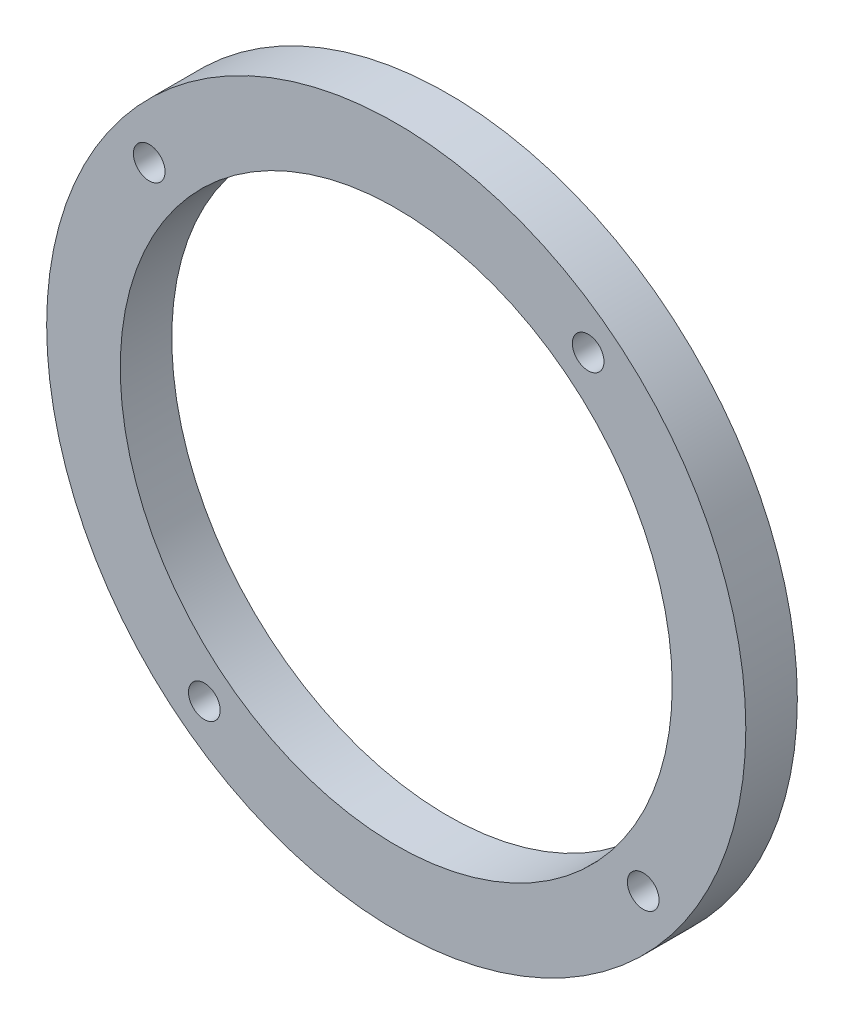
ISO-10303-21;
HEADER;
FILE_DESCRIPTION(('STEP AP214'),'2;1');
FILE_NAME('part.step','',(''),(''),'','','');
FILE_SCHEMA(('AUTOMOTIVE_DESIGN { 1 0 10303 214 1 1 1 1 }'));
ENDSEC;
DATA;
#1=APPLICATION_CONTEXT('core data for automotive mechanical design processes');
#2=APPLICATION_PROTOCOL_DEFINITION('international standard','automotive_design',2000,#1);
#3=PRODUCT_CONTEXT('',#1,'mechanical');
#4=PRODUCT('Part','Part','',(#3));
#5=PRODUCT_RELATED_PRODUCT_CATEGORY('part','',(#4));
#6=PRODUCT_DEFINITION_FORMATION('','',#4);
#7=PRODUCT_DEFINITION_CONTEXT('part definition',#1,'design');
#8=PRODUCT_DEFINITION('design','',#6,#7);
#9=PRODUCT_DEFINITION_SHAPE('','',#8);
#10=(LENGTH_UNIT() NAMED_UNIT(*) SI_UNIT(.MILLI.,.METRE.));
#11=(NAMED_UNIT(*) PLANE_ANGLE_UNIT() SI_UNIT($,.RADIAN.));
#12=(NAMED_UNIT(*) SI_UNIT($,.STERADIAN.) SOLID_ANGLE_UNIT());
#13=UNCERTAINTY_MEASURE_WITH_UNIT(LENGTH_MEASURE(1.E-05),#10,'distance_accuracy_value','');
#14=(GEOMETRIC_REPRESENTATION_CONTEXT(3) GLOBAL_UNCERTAINTY_ASSIGNED_CONTEXT((#13)) GLOBAL_UNIT_ASSIGNED_CONTEXT((#10,
#11,#12)) REPRESENTATION_CONTEXT('',''));
#15=CARTESIAN_POINT('',(0.,0.,0.));
#16=DIRECTION('',(0.,0.,1.));
#17=DIRECTION('',(1.,0.,0.));
#18=AXIS2_PLACEMENT_3D('',#15,#16,#17);
#19=CARTESIAN_POINT('',(0.,0.,7.));
#20=DIRECTION('',(0.,0.,1.));
#21=DIRECTION('',(1.,0.,0.));
#22=AXIS2_PLACEMENT_3D('',#19,#20,#21);
#23=PLANE('',#22);
#24=CARTESIAN_POINT('',(-33.5598092124542,26.0766026472713,7.));
#25=DIRECTION('',(0.,0.,1.));
#26=DIRECTION('',(1.,0.,0.));
#27=AXIS2_PLACEMENT_3D('',#24,#25,#26);
#28=CIRCLE('',#27,2.15000000000001);
#29=CARTESIAN_POINT('',(-31.4098092124542,26.0766026472713,7.));
#30=VERTEX_POINT('',#29);
#31=EDGE_CURVE('E76',#30,#30,#28,.T.);
#32=ORIENTED_EDGE('',*,*,#31,.F.);
#33=EDGE_LOOP('',(#32));
#34=FACE_BOUND('',#33,.T.);
#35=CARTESIAN_POINT('',(26.0766026472713,33.5598092124542,7.));
#36=DIRECTION('',(0.,0.,1.));
#37=DIRECTION('',(1.,0.,0.));
#38=AXIS2_PLACEMENT_3D('',#35,#36,#37);
#39=CIRCLE('',#38,2.15);
#40=CARTESIAN_POINT('',(28.2266026472713,33.5598092124542,7.));
#41=VERTEX_POINT('',#40);
#42=EDGE_CURVE('E73',#41,#41,#39,.T.);
#43=ORIENTED_EDGE('',*,*,#42,.F.);
#44=EDGE_LOOP('',(#43));
#45=FACE_BOUND('',#44,.T.);
#46=CARTESIAN_POINT('',(33.5598092124542,-26.0766026472713,7.));
#47=DIRECTION('',(0.,0.,1.));
#48=DIRECTION('',(1.,0.,0.));
#49=AXIS2_PLACEMENT_3D('',#46,#47,#48);
#50=CIRCLE('',#49,2.15);
#51=CARTESIAN_POINT('',(35.7098092124542,-26.0766026472713,7.));
#52=VERTEX_POINT('',#51);
#53=EDGE_CURVE('E67',#52,#52,#50,.T.);
#54=ORIENTED_EDGE('',*,*,#53,.F.);
#55=EDGE_LOOP('',(#54));
#56=FACE_BOUND('',#55,.T.);
#57=CARTESIAN_POINT('',(-26.0766026472713,-33.5598092124542,7.));
#58=DIRECTION('',(0.,0.,1.));
#59=DIRECTION('',(1.,0.,0.));
#60=AXIS2_PLACEMENT_3D('',#57,#58,#59);
#61=CIRCLE('',#60,2.15);
#62=CARTESIAN_POINT('',(-23.9266026472713,-33.5598092124542,7.));
#63=VERTEX_POINT('',#62);
#64=EDGE_CURVE('E60',#63,#63,#61,.T.);
#65=ORIENTED_EDGE('',*,*,#64,.F.);
#66=EDGE_LOOP('',(#65));
#67=FACE_BOUND('',#66,.T.);
#68=CARTESIAN_POINT('',(0.,0.,7.));
#69=DIRECTION('',(0.,0.,1.));
#70=DIRECTION('',(1.,0.,0.));
#71=AXIS2_PLACEMENT_3D('',#68,#69,#70);
#72=CIRCLE('',#71,47.5);
#73=CARTESIAN_POINT('',(47.5,0.,7.));
#74=VERTEX_POINT('',#73);
#75=EDGE_CURVE('E10',#74,#74,#72,.T.);
#76=ORIENTED_EDGE('',*,*,#75,.T.);
#77=EDGE_LOOP('',(#76));
#78=FACE_BOUND('',#77,.T.);
#79=CARTESIAN_POINT('',(0.,0.,7.));
#80=DIRECTION('',(0.,0.,1.));
#81=DIRECTION('',(1.,0.,0.));
#82=AXIS2_PLACEMENT_3D('',#79,#80,#81);
#83=CIRCLE('',#82,37.5);
#84=CARTESIAN_POINT('',(37.5,0.,7.));
#85=VERTEX_POINT('',#84);
#86=EDGE_CURVE('E52',#85,#85,#83,.T.);
#87=ORIENTED_EDGE('',*,*,#86,.F.);
#88=EDGE_LOOP('',(#87));
#89=FACE_BOUND('',#88,.T.);
#90=ADVANCED_FACE('F41',(#34,#45,#56,#67,#78,#89),#23,.T.);
#91=CARTESIAN_POINT('',(0.,0.,0.));
#92=DIRECTION('',(0.,0.,1.));
#93=DIRECTION('',(1.,0.,0.));
#94=AXIS2_PLACEMENT_3D('',#91,#92,#93);
#95=PLANE('',#94);
#96=CARTESIAN_POINT('',(-33.5598092124542,26.0766026472713,0.));
#97=DIRECTION('',(0.,0.,1.));
#98=DIRECTION('',(1.,0.,0.));
#99=AXIS2_PLACEMENT_3D('',#96,#97,#98);
#100=CIRCLE('',#99,2.15000000000001);
#101=CARTESIAN_POINT('',(-31.4098092124542,26.0766026472713,0.));
#102=VERTEX_POINT('',#101);
#103=EDGE_CURVE('E57',#102,#102,#100,.F.);
#104=ORIENTED_EDGE('',*,*,#103,.F.);
#105=EDGE_LOOP('',(#104));
#106=FACE_BOUND('',#105,.T.);
#107=CARTESIAN_POINT('',(26.0766026472713,33.5598092124542,0.));
#108=DIRECTION('',(0.,0.,1.));
#109=DIRECTION('',(1.,0.,0.));
#110=AXIS2_PLACEMENT_3D('',#107,#108,#109);
#111=CIRCLE('',#110,2.15);
#112=CARTESIAN_POINT('',(28.2266026472713,33.5598092124542,0.));
#113=VERTEX_POINT('',#112);
#114=EDGE_CURVE('E70',#113,#113,#111,.F.);
#115=ORIENTED_EDGE('',*,*,#114,.F.);
#116=EDGE_LOOP('',(#115));
#117=FACE_BOUND('',#116,.T.);
#118=CARTESIAN_POINT('',(33.5598092124542,-26.0766026472713,0.));
#119=DIRECTION('',(0.,0.,1.));
#120=DIRECTION('',(1.,0.,0.));
#121=AXIS2_PLACEMENT_3D('',#118,#119,#120);
#122=CIRCLE('',#121,2.15);
#123=CARTESIAN_POINT('',(35.7098092124542,-26.0766026472713,0.));
#124=VERTEX_POINT('',#123);
#125=EDGE_CURVE('E63',#124,#124,#122,.F.);
#126=ORIENTED_EDGE('',*,*,#125,.F.);
#127=EDGE_LOOP('',(#126));
#128=FACE_BOUND('',#127,.T.);
#129=CARTESIAN_POINT('',(-26.0766026472713,-33.5598092124542,0.));
#130=DIRECTION('',(0.,0.,1.));
#131=DIRECTION('',(1.,0.,0.));
#132=AXIS2_PLACEMENT_3D('',#129,#130,#131);
#133=CIRCLE('',#132,2.15);
#134=CARTESIAN_POINT('',(-23.9266026472713,-33.5598092124542,0.));
#135=VERTEX_POINT('',#134);
#136=EDGE_CURVE('E64',#135,#135,#133,.F.);
#137=ORIENTED_EDGE('',*,*,#136,.F.);
#138=EDGE_LOOP('',(#137));
#139=FACE_BOUND('',#138,.T.);
#140=CARTESIAN_POINT('',(0.,0.,0.));
#141=DIRECTION('',(0.,0.,1.));
#142=DIRECTION('',(1.,0.,0.));
#143=AXIS2_PLACEMENT_3D('',#140,#141,#142);
#144=CIRCLE('',#143,47.5);
#145=CARTESIAN_POINT('',(47.5,0.,0.));
#146=VERTEX_POINT('',#145);
#147=EDGE_CURVE('E45',#146,#146,#144,.T.);
#148=ORIENTED_EDGE('',*,*,#147,.F.);
#149=EDGE_LOOP('',(#148));
#150=FACE_BOUND('',#149,.T.);
#151=CARTESIAN_POINT('',(0.,0.,0.));
#152=DIRECTION('',(0.,0.,1.));
#153=DIRECTION('',(1.,0.,0.));
#154=AXIS2_PLACEMENT_3D('',#151,#152,#153);
#155=CIRCLE('',#154,37.5);
#156=CARTESIAN_POINT('',(37.5,0.,0.));
#157=VERTEX_POINT('',#156);
#158=EDGE_CURVE('E54',#157,#157,#155,.T.);
#159=ORIENTED_EDGE('',*,*,#158,.T.);
#160=EDGE_LOOP('',(#159));
#161=FACE_BOUND('',#160,.T.);
#162=ADVANCED_FACE('F89',(#106,#117,#128,#139,#150,#161),#95,.F.);
#163=CARTESIAN_POINT('',(0.,0.,7.));
#164=DIRECTION('',(0.,0.,-1.));
#165=DIRECTION('',(-1.,0.,0.));
#166=AXIS2_PLACEMENT_3D('',#163,#164,#165);
#167=CYLINDRICAL_SURFACE('',#166,47.5);
#168=ORIENTED_EDGE('',*,*,#75,.F.);
#169=EDGE_LOOP('',(#168));
#170=FACE_BOUND('',#169,.T.);
#171=ORIENTED_EDGE('',*,*,#147,.T.);
#172=EDGE_LOOP('',(#171));
#173=FACE_BOUND('',#172,.T.);
#174=ADVANCED_FACE('F43',(#170,#173),#167,.T.);
#175=CARTESIAN_POINT('',(0.,0.,7.));
#176=DIRECTION('',(0.,0.,-1.));
#177=DIRECTION('',(-1.,0.,0.));
#178=AXIS2_PLACEMENT_3D('',#175,#176,#177);
#179=CYLINDRICAL_SURFACE('',#178,37.5);
#180=ORIENTED_EDGE('',*,*,#86,.T.);
#181=EDGE_LOOP('',(#180));
#182=FACE_BOUND('',#181,.T.);
#183=ORIENTED_EDGE('',*,*,#158,.F.);
#184=EDGE_LOOP('',(#183));
#185=FACE_BOUND('',#184,.T.);
#186=ADVANCED_FACE('F99',(#182,#185),#179,.F.);
#187=CARTESIAN_POINT('',(-26.0766026472713,-33.5598092124542,-0.00100000000000013));
#188=DIRECTION('',(0.,0.,1.));
#189=DIRECTION('',(1.,0.,0.));
#190=AXIS2_PLACEMENT_3D('',#187,#188,#189);
#191=CYLINDRICAL_SURFACE('',#190,2.15);
#192=ORIENTED_EDGE('',*,*,#64,.T.);
#193=EDGE_LOOP('',(#192));
#194=FACE_BOUND('',#193,.T.);
#195=ORIENTED_EDGE('',*,*,#136,.T.);
#196=EDGE_LOOP('',(#195));
#197=FACE_BOUND('',#196,.T.);
#198=ADVANCED_FACE('F102',(#194,#197),#191,.F.);
#199=CARTESIAN_POINT('',(33.5598092124542,-26.0766026472713,-0.00100000000000013));
#200=DIRECTION('',(0.,0.,1.));
#201=DIRECTION('',(1.,0.,0.));
#202=AXIS2_PLACEMENT_3D('',#199,#200,#201);
#203=CYLINDRICAL_SURFACE('',#202,2.15);
#204=ORIENTED_EDGE('',*,*,#53,.T.);
#205=EDGE_LOOP('',(#204));
#206=FACE_BOUND('',#205,.T.);
#207=ORIENTED_EDGE('',*,*,#125,.T.);
#208=EDGE_LOOP('',(#207));
#209=FACE_BOUND('',#208,.T.);
#210=ADVANCED_FACE('F117',(#206,#209),#203,.F.);
#211=CARTESIAN_POINT('',(26.0766026472713,33.5598092124542,-0.00100000000000013));
#212=DIRECTION('',(0.,0.,1.));
#213=DIRECTION('',(1.,0.,0.));
#214=AXIS2_PLACEMENT_3D('',#211,#212,#213);
#215=CYLINDRICAL_SURFACE('',#214,2.15);
#216=ORIENTED_EDGE('',*,*,#42,.T.);
#217=EDGE_LOOP('',(#216));
#218=FACE_BOUND('',#217,.T.);
#219=ORIENTED_EDGE('',*,*,#114,.T.);
#220=EDGE_LOOP('',(#219));
#221=FACE_BOUND('',#220,.T.);
#222=ADVANCED_FACE('F121',(#218,#221),#215,.F.);
#223=CARTESIAN_POINT('',(-33.5598092124542,26.0766026472713,-0.00100000000000013));
#224=DIRECTION('',(0.,0.,1.));
#225=DIRECTION('',(1.,0.,0.));
#226=AXIS2_PLACEMENT_3D('',#223,#224,#225);
#227=CYLINDRICAL_SURFACE('',#226,2.15000000000001);
#228=ORIENTED_EDGE('',*,*,#31,.T.);
#229=EDGE_LOOP('',(#228));
#230=FACE_BOUND('',#229,.T.);
#231=ORIENTED_EDGE('',*,*,#103,.T.);
#232=EDGE_LOOP('',(#231));
#233=FACE_BOUND('',#232,.T.);
#234=ADVANCED_FACE('F84',(#230,#233),#227,.F.);
#235=CLOSED_SHELL('',(#90,#162,#174,#186,#198,#210,#222,#234));
#236=MANIFOLD_SOLID_BREP('B2',#235);
#237=ADVANCED_BREP_SHAPE_REPRESENTATION('',(#18,#236),#14);
#238=SHAPE_DEFINITION_REPRESENTATION(#9,#237);
ENDSEC;
END-ISO-10303-21;
